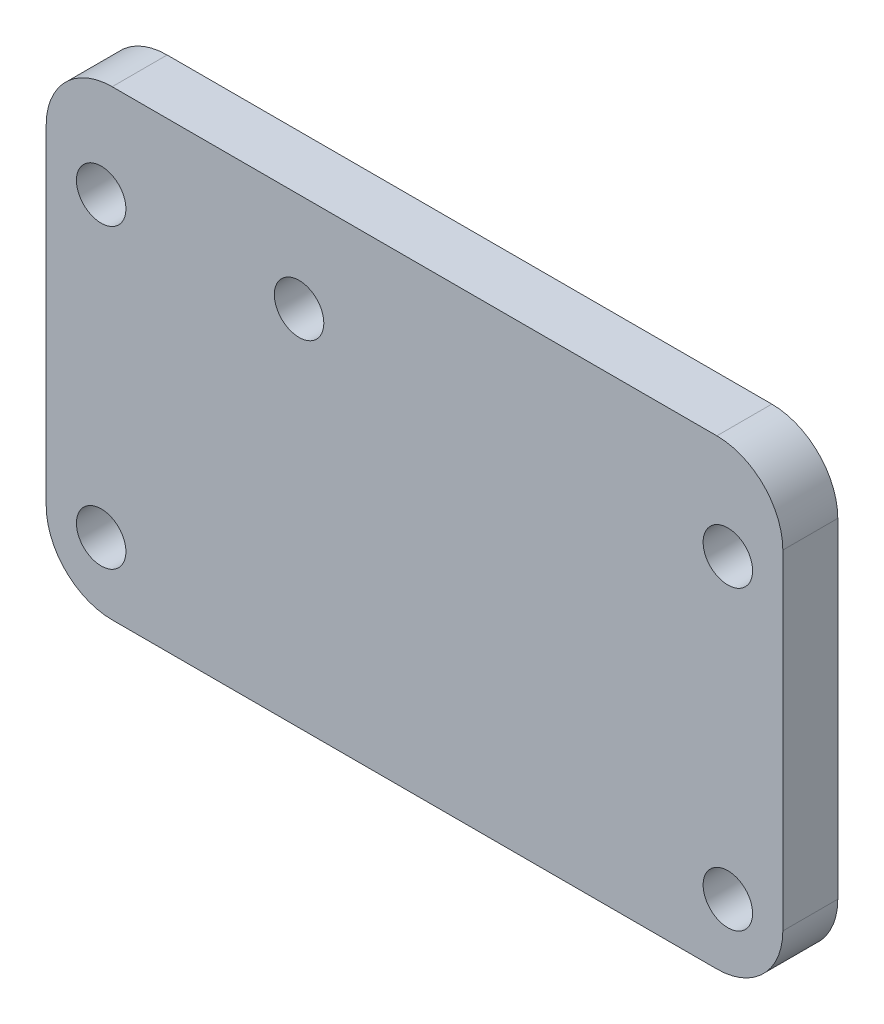
ISO-10303-21;
HEADER;
FILE_DESCRIPTION(('STEP AP214'),'2;1');
FILE_NAME('part.step','',(''),(''),'','','');
FILE_SCHEMA(('AUTOMOTIVE_DESIGN { 1 0 10303 214 1 1 1 1 }'));
ENDSEC;
DATA;
#1=APPLICATION_CONTEXT('core data for automotive mechanical design processes');
#2=APPLICATION_PROTOCOL_DEFINITION('international standard','automotive_design',2000,#1);
#3=PRODUCT_CONTEXT('',#1,'mechanical');
#4=PRODUCT('Part','Part','',(#3));
#5=PRODUCT_RELATED_PRODUCT_CATEGORY('part','',(#4));
#6=PRODUCT_DEFINITION_FORMATION('','',#4);
#7=PRODUCT_DEFINITION_CONTEXT('part definition',#1,'design');
#8=PRODUCT_DEFINITION('design','',#6,#7);
#9=PRODUCT_DEFINITION_SHAPE('','',#8);
#10=(LENGTH_UNIT() NAMED_UNIT(*) SI_UNIT(.MILLI.,.METRE.));
#11=(NAMED_UNIT(*) PLANE_ANGLE_UNIT() SI_UNIT($,.RADIAN.));
#12=(NAMED_UNIT(*) SI_UNIT($,.STERADIAN.) SOLID_ANGLE_UNIT());
#13=UNCERTAINTY_MEASURE_WITH_UNIT(LENGTH_MEASURE(1.E-05),#10,'distance_accuracy_value','');
#14=(GEOMETRIC_REPRESENTATION_CONTEXT(3) GLOBAL_UNCERTAINTY_ASSIGNED_CONTEXT((#13)) GLOBAL_UNIT_ASSIGNED_CONTEXT((#10,
#11,#12)) REPRESENTATION_CONTEXT('',''));
#15=CARTESIAN_POINT('',(0.,0.,0.));
#16=DIRECTION('',(0.,0.,1.));
#17=DIRECTION('',(1.,0.,0.));
#18=AXIS2_PLACEMENT_3D('',#15,#16,#17);
#19=CARTESIAN_POINT('',(0.,0.,5.));
#20=DIRECTION('',(1.,0.,0.));
#21=DIRECTION('',(0.,0.,-1.));
#22=AXIS2_PLACEMENT_3D('',#19,#20,#21);
#23=PLANE('',#22);
#24=DIRECTION('',(0.,-1.,0.));
#25=VECTOR('',#24,1.);
#26=CARTESIAN_POINT('',(0.,0.,0.));
#27=LINE('',#26,#25);
#28=CARTESIAN_POINT('',(0.,36.,0.));
#29=VERTEX_POINT('',#28);
#30=CARTESIAN_POINT('',(0.,6.,0.));
#31=VERTEX_POINT('',#30);
#32=EDGE_CURVE('E242',#29,#31,#27,.T.);
#33=ORIENTED_EDGE('',*,*,#32,.T.);
#34=DIRECTION('',(0.,0.,-1.));
#35=VECTOR('',#34,1.);
#36=CARTESIAN_POINT('',(0.,6.,5.));
#37=LINE('',#36,#35);
#38=CARTESIAN_POINT('',(0.,6.,5.));
#39=VERTEX_POINT('',#38);
#40=EDGE_CURVE('E284',#31,#39,#37,.F.);
#41=ORIENTED_EDGE('',*,*,#40,.T.);
#42=DIRECTION('',(0.,-1.,0.));
#43=VECTOR('',#42,1.);
#44=CARTESIAN_POINT('',(0.,0.,5.));
#45=LINE('',#44,#43);
#46=CARTESIAN_POINT('',(0.,36.,5.));
#47=VERTEX_POINT('',#46);
#48=EDGE_CURVE('E245',#47,#39,#45,.T.);
#49=ORIENTED_EDGE('',*,*,#48,.F.);
#50=DIRECTION('',(0.,0.,-1.));
#51=VECTOR('',#50,1.);
#52=CARTESIAN_POINT('',(0.,36.,5.));
#53=LINE('',#52,#51);
#54=EDGE_CURVE('E281',#47,#29,#53,.T.);
#55=ORIENTED_EDGE('',*,*,#54,.T.);
#56=EDGE_LOOP('',(#33,#41,#49,#55));
#57=FACE_BOUND('',#56,.T.);
#58=ADVANCED_FACE('F35',(#57),#23,.F.);
#59=CARTESIAN_POINT('',(0.,0.,5.));
#60=DIRECTION('',(0.,1.,0.));
#61=DIRECTION('',(0.,0.,1.));
#62=AXIS2_PLACEMENT_3D('',#59,#60,#61);
#63=PLANE('',#62);
#64=DIRECTION('',(1.,0.,0.));
#65=VECTOR('',#64,1.);
#66=CARTESIAN_POINT('',(0.,0.,5.));
#67=LINE('',#66,#65);
#68=CARTESIAN_POINT('',(6.,0.,5.));
#69=VERTEX_POINT('',#68);
#70=CARTESIAN_POINT('',(61.,0.,5.));
#71=VERTEX_POINT('',#70);
#72=EDGE_CURVE('E248',#69,#71,#67,.T.);
#73=ORIENTED_EDGE('',*,*,#72,.F.);
#74=DIRECTION('',(0.,0.,-1.));
#75=VECTOR('',#74,1.);
#76=CARTESIAN_POINT('',(6.,0.,5.));
#77=LINE('',#76,#75);
#78=CARTESIAN_POINT('',(6.,0.,0.));
#79=VERTEX_POINT('',#78);
#80=EDGE_CURVE('E270',#69,#79,#77,.T.);
#81=ORIENTED_EDGE('',*,*,#80,.T.);
#82=DIRECTION('',(1.,0.,0.));
#83=VECTOR('',#82,1.);
#84=CARTESIAN_POINT('',(0.,0.,0.));
#85=LINE('',#84,#83);
#86=CARTESIAN_POINT('',(61.,0.,0.));
#87=VERTEX_POINT('',#86);
#88=EDGE_CURVE('E261',#79,#87,#85,.T.);
#89=ORIENTED_EDGE('',*,*,#88,.T.);
#90=DIRECTION('',(0.,0.,-1.));
#91=VECTOR('',#90,1.);
#92=CARTESIAN_POINT('',(61.,0.,5.));
#93=LINE('',#92,#91);
#94=EDGE_CURVE('E258',#87,#71,#93,.F.);
#95=ORIENTED_EDGE('',*,*,#94,.T.);
#96=EDGE_LOOP('',(#73,#81,#89,#95));
#97=FACE_BOUND('',#96,.T.);
#98=ADVANCED_FACE('F333',(#97),#63,.F.);
#99=CARTESIAN_POINT('',(67.,0.,5.));
#100=DIRECTION('',(-1.,0.,0.));
#101=DIRECTION('',(0.,0.,1.));
#102=AXIS2_PLACEMENT_3D('',#99,#100,#101);
#103=PLANE('',#102);
#104=DIRECTION('',(0.,1.,0.));
#105=VECTOR('',#104,1.);
#106=CARTESIAN_POINT('',(67.,0.,5.));
#107=LINE('',#106,#105);
#108=CARTESIAN_POINT('',(67.,6.,5.));
#109=VERTEX_POINT('',#108);
#110=CARTESIAN_POINT('',(67.,36.,5.));
#111=VERTEX_POINT('',#110);
#112=EDGE_CURVE('E252',#109,#111,#107,.T.);
#113=ORIENTED_EDGE('',*,*,#112,.F.);
#114=DIRECTION('',(0.,0.,-1.));
#115=VECTOR('',#114,1.);
#116=CARTESIAN_POINT('',(67.,6.,5.));
#117=LINE('',#116,#115);
#118=CARTESIAN_POINT('',(67.,6.,0.));
#119=VERTEX_POINT('',#118);
#120=EDGE_CURVE('E11',#109,#119,#117,.T.);
#121=ORIENTED_EDGE('',*,*,#120,.T.);
#122=DIRECTION('',(0.,1.,0.));
#123=VECTOR('',#122,1.);
#124=CARTESIAN_POINT('',(67.,0.,0.));
#125=LINE('',#124,#123);
#126=CARTESIAN_POINT('',(67.,36.,0.));
#127=VERTEX_POINT('',#126);
#128=EDGE_CURVE('E264',#119,#127,#125,.T.);
#129=ORIENTED_EDGE('',*,*,#128,.T.);
#130=DIRECTION('',(0.,0.,-1.));
#131=VECTOR('',#130,1.);
#132=CARTESIAN_POINT('',(67.,36.,5.));
#133=LINE('',#132,#131);
#134=EDGE_CURVE('E44',#127,#111,#133,.F.);
#135=ORIENTED_EDGE('',*,*,#134,.T.);
#136=EDGE_LOOP('',(#113,#121,#129,#135));
#137=FACE_BOUND('',#136,.T.);
#138=ADVANCED_FACE('F302',(#137),#103,.F.);
#139=CARTESIAN_POINT('',(0.,42.,5.));
#140=DIRECTION('',(0.,-1.,0.));
#141=DIRECTION('',(0.,0.,-1.));
#142=AXIS2_PLACEMENT_3D('',#139,#140,#141);
#143=PLANE('',#142);
#144=DIRECTION('',(-1.,0.,0.));
#145=VECTOR('',#144,1.);
#146=CARTESIAN_POINT('',(0.,42.,0.));
#147=LINE('',#146,#145);
#148=CARTESIAN_POINT('',(61.,42.,0.));
#149=VERTEX_POINT('',#148);
#150=CARTESIAN_POINT('',(6.,42.,0.));
#151=VERTEX_POINT('',#150);
#152=EDGE_CURVE('E249',#149,#151,#147,.T.);
#153=ORIENTED_EDGE('',*,*,#152,.T.);
#154=DIRECTION('',(0.,0.,-1.));
#155=VECTOR('',#154,1.);
#156=CARTESIAN_POINT('',(6.,42.,5.));
#157=LINE('',#156,#155);
#158=CARTESIAN_POINT('',(6.,42.,5.));
#159=VERTEX_POINT('',#158);
#160=EDGE_CURVE('E297',#151,#159,#157,.F.);
#161=ORIENTED_EDGE('',*,*,#160,.T.);
#162=DIRECTION('',(-1.,0.,0.));
#163=VECTOR('',#162,1.);
#164=CARTESIAN_POINT('',(0.,42.,5.));
#165=LINE('',#164,#163);
#166=CARTESIAN_POINT('',(61.,42.,5.));
#167=VERTEX_POINT('',#166);
#168=EDGE_CURVE('E255',#167,#159,#165,.T.);
#169=ORIENTED_EDGE('',*,*,#168,.F.);
#170=DIRECTION('',(0.,0.,-1.));
#171=VECTOR('',#170,1.);
#172=CARTESIAN_POINT('',(61.,42.,5.));
#173=LINE('',#172,#171);
#174=EDGE_CURVE('E294',#167,#149,#173,.T.);
#175=ORIENTED_EDGE('',*,*,#174,.T.);
#176=EDGE_LOOP('',(#153,#161,#169,#175));
#177=FACE_BOUND('',#176,.T.);
#178=ADVANCED_FACE('F314',(#177),#143,.F.);
#179=CARTESIAN_POINT('',(0.,0.,5.));
#180=DIRECTION('',(0.,0.,-1.));
#181=DIRECTION('',(-1.,0.,0.));
#182=AXIS2_PLACEMENT_3D('',#179,#180,#181);
#183=PLANE('',#182);
#184=CARTESIAN_POINT('',(23.,33.,5.));
#185=DIRECTION('',(0.,0.,1.));
#186=DIRECTION('',(1.,0.,0.));
#187=AXIS2_PLACEMENT_3D('',#184,#185,#186);
#188=CIRCLE('',#187,2.25);
#189=CARTESIAN_POINT('',(25.25,33.,5.));
#190=VERTEX_POINT('',#189);
#191=EDGE_CURVE('E217',#190,#190,#188,.T.);
#192=ORIENTED_EDGE('',*,*,#191,.F.);
#193=EDGE_LOOP('',(#192));
#194=FACE_BOUND('',#193,.T.);
#195=CARTESIAN_POINT('',(62.,33.,5.));
#196=DIRECTION('',(0.,0.,-1.));
#197=DIRECTION('',(-1.,0.,0.));
#198=AXIS2_PLACEMENT_3D('',#195,#196,#197);
#199=CIRCLE('',#198,2.25);
#200=CARTESIAN_POINT('',(59.75,33.,5.));
#201=VERTEX_POINT('',#200);
#202=EDGE_CURVE('E220',#201,#201,#199,.T.);
#203=ORIENTED_EDGE('',*,*,#202,.T.);
#204=EDGE_LOOP('',(#203));
#205=FACE_BOUND('',#204,.T.);
#206=CARTESIAN_POINT('',(5.,6.,5.));
#207=DIRECTION('',(0.,0.,-1.));
#208=DIRECTION('',(-1.,0.,0.));
#209=AXIS2_PLACEMENT_3D('',#206,#207,#208);
#210=CIRCLE('',#209,2.25);
#211=CARTESIAN_POINT('',(2.75,6.,5.));
#212=VERTEX_POINT('',#211);
#213=EDGE_CURVE('E227',#212,#212,#210,.T.);
#214=ORIENTED_EDGE('',*,*,#213,.T.);
#215=EDGE_LOOP('',(#214));
#216=FACE_BOUND('',#215,.T.);
#217=CARTESIAN_POINT('',(5.,33.,5.));
#218=DIRECTION('',(0.,0.,-1.));
#219=DIRECTION('',(-1.,0.,0.));
#220=AXIS2_PLACEMENT_3D('',#217,#218,#219);
#221=CIRCLE('',#220,2.25);
#222=CARTESIAN_POINT('',(2.74999999999999,33.,5.));
#223=VERTEX_POINT('',#222);
#224=EDGE_CURVE('E233',#223,#223,#221,.T.);
#225=ORIENTED_EDGE('',*,*,#224,.T.);
#226=EDGE_LOOP('',(#225));
#227=FACE_BOUND('',#226,.T.);
#228=CARTESIAN_POINT('',(62.,6.,5.));
#229=DIRECTION('',(0.,0.,-1.));
#230=DIRECTION('',(-1.,0.,0.));
#231=AXIS2_PLACEMENT_3D('',#228,#229,#230);
#232=CIRCLE('',#231,2.25);
#233=CARTESIAN_POINT('',(59.75,6.,5.));
#234=VERTEX_POINT('',#233);
#235=EDGE_CURVE('E239',#234,#234,#232,.T.);
#236=ORIENTED_EDGE('',*,*,#235,.T.);
#237=EDGE_LOOP('',(#236));
#238=FACE_BOUND('',#237,.T.);
#239=ORIENTED_EDGE('',*,*,#48,.T.);
#240=CARTESIAN_POINT('',(6.,6.,5.));
#241=DIRECTION('',(0.,0.,-1.));
#242=DIRECTION('',(-1.,0.,0.));
#243=AXIS2_PLACEMENT_3D('',#240,#241,#242);
#244=CIRCLE('',#243,6.);
#245=EDGE_CURVE('E292',#39,#69,#244,.F.);
#246=ORIENTED_EDGE('',*,*,#245,.T.);
#247=ORIENTED_EDGE('',*,*,#72,.T.);
#248=CARTESIAN_POINT('',(61.,6.,5.));
#249=DIRECTION('',(0.,0.,-1.));
#250=DIRECTION('',(-1.,0.,0.));
#251=AXIS2_PLACEMENT_3D('',#248,#249,#250);
#252=CIRCLE('',#251,6.);
#253=EDGE_CURVE('E288',#71,#109,#252,.F.);
#254=ORIENTED_EDGE('',*,*,#253,.T.);
#255=ORIENTED_EDGE('',*,*,#112,.T.);
#256=CARTESIAN_POINT('',(61.,36.,5.));
#257=DIRECTION('',(0.,0.,-1.));
#258=DIRECTION('',(-1.,0.,0.));
#259=AXIS2_PLACEMENT_3D('',#256,#257,#258);
#260=CIRCLE('',#259,6.);
#261=EDGE_CURVE('E286',#111,#167,#260,.F.);
#262=ORIENTED_EDGE('',*,*,#261,.T.);
#263=ORIENTED_EDGE('',*,*,#168,.T.);
#264=CARTESIAN_POINT('',(6.,36.,5.));
#265=DIRECTION('',(0.,0.,-1.));
#266=DIRECTION('',(-1.,0.,0.));
#267=AXIS2_PLACEMENT_3D('',#264,#265,#266);
#268=CIRCLE('',#267,6.);
#269=EDGE_CURVE('E290',#159,#47,#268,.F.);
#270=ORIENTED_EDGE('',*,*,#269,.T.);
#271=EDGE_LOOP('',(#239,#246,#247,#254,#255,#262,#263,#270));
#272=FACE_BOUND('',#271,.T.);
#273=ADVANCED_FACE('F308',(#194,#205,#216,#227,#238,#272),#183,.F.);
#274=CARTESIAN_POINT('',(0.,0.,0.));
#275=DIRECTION('',(0.,0.,-1.));
#276=DIRECTION('',(-1.,0.,0.));
#277=AXIS2_PLACEMENT_3D('',#274,#275,#276);
#278=PLANE('',#277);
#279=DIRECTION('',(0.,-1.,0.));
#280=VECTOR('',#279,1.);
#281=CARTESIAN_POINT('',(30.,0.,0.));
#282=LINE('',#281,#280);
#283=CARTESIAN_POINT('',(30.,36.,0.));
#284=VERTEX_POINT('',#283);
#285=CARTESIAN_POINT('',(30.,30.,0.));
#286=VERTEX_POINT('',#285);
#287=EDGE_CURVE('E156',#284,#286,#282,.T.);
#288=ORIENTED_EDGE('',*,*,#287,.T.);
#289=DIRECTION('',(-1.,0.,0.));
#290=VECTOR('',#289,1.);
#291=CARTESIAN_POINT('',(0.,30.,0.));
#292=LINE('',#291,#290);
#293=CARTESIAN_POINT('',(55.,30.,0.));
#294=VERTEX_POINT('',#293);
#295=EDGE_CURVE('E170',#294,#286,#292,.T.);
#296=ORIENTED_EDGE('',*,*,#295,.F.);
#297=DIRECTION('',(0.,-1.,0.));
#298=VECTOR('',#297,1.);
#299=CARTESIAN_POINT('',(55.,0.,0.));
#300=LINE('',#299,#298);
#301=CARTESIAN_POINT('',(55.,36.,0.));
#302=VERTEX_POINT('',#301);
#303=EDGE_CURVE('E183',#302,#294,#300,.T.);
#304=ORIENTED_EDGE('',*,*,#303,.F.);
#305=DIRECTION('',(-1.,0.,0.));
#306=VECTOR('',#305,1.);
#307=CARTESIAN_POINT('',(0.,36.,0.));
#308=LINE('',#307,#306);
#309=EDGE_CURVE('E181',#302,#284,#308,.T.);
#310=ORIENTED_EDGE('',*,*,#309,.T.);
#311=EDGE_LOOP('',(#288,#296,#304,#310));
#312=FACE_BOUND('',#311,.T.);
#313=DIRECTION('',(-1.,0.,0.));
#314=VECTOR('',#313,1.);
#315=CARTESIAN_POINT('',(0.,36.,0.));
#316=LINE('',#315,#314);
#317=CARTESIAN_POINT('',(16.,36.,0.));
#318=VERTEX_POINT('',#317);
#319=CARTESIAN_POINT('',(12.,36.,0.));
#320=VERTEX_POINT('',#319);
#321=EDGE_CURVE('E161',#318,#320,#316,.T.);
#322=ORIENTED_EDGE('',*,*,#321,.T.);
#323=DIRECTION('',(0.,-1.,0.));
#324=VECTOR('',#323,1.);
#325=CARTESIAN_POINT('',(12.,0.,0.));
#326=LINE('',#325,#324);
#327=CARTESIAN_POINT('',(12.,30.,0.));
#328=VERTEX_POINT('',#327);
#329=EDGE_CURVE('E193',#320,#328,#326,.T.);
#330=ORIENTED_EDGE('',*,*,#329,.T.);
#331=DIRECTION('',(-1.,0.,0.));
#332=VECTOR('',#331,1.);
#333=CARTESIAN_POINT('',(0.,30.,0.));
#334=LINE('',#333,#332);
#335=CARTESIAN_POINT('',(16.,30.,0.));
#336=VERTEX_POINT('',#335);
#337=EDGE_CURVE('E203',#336,#328,#334,.T.);
#338=ORIENTED_EDGE('',*,*,#337,.F.);
#339=DIRECTION('',(0.,-1.,0.));
#340=VECTOR('',#339,1.);
#341=CARTESIAN_POINT('',(16.,0.,0.));
#342=LINE('',#341,#340);
#343=EDGE_CURVE('E59',#318,#336,#342,.T.);
#344=ORIENTED_EDGE('',*,*,#343,.F.);
#345=EDGE_LOOP('',(#322,#330,#338,#344));
#346=FACE_BOUND('',#345,.T.);
#347=CARTESIAN_POINT('',(23.,33.,0.));
#348=DIRECTION('',(0.,0.,-1.));
#349=DIRECTION('',(-1.,0.,0.));
#350=AXIS2_PLACEMENT_3D('',#347,#348,#349);
#351=CIRCLE('',#350,2.25);
#352=CARTESIAN_POINT('',(20.75,33.,0.));
#353=VERTEX_POINT('',#352);
#354=EDGE_CURVE('E39',#353,#353,#351,.T.);
#355=ORIENTED_EDGE('',*,*,#354,.F.);
#356=EDGE_LOOP('',(#355));
#357=FACE_BOUND('',#356,.T.);
#358=CARTESIAN_POINT('',(62.,33.,0.));
#359=DIRECTION('',(0.,0.,-1.));
#360=DIRECTION('',(-1.,0.,0.));
#361=AXIS2_PLACEMENT_3D('',#358,#359,#360);
#362=CIRCLE('',#361,2.25);
#363=CARTESIAN_POINT('',(59.75,33.,0.));
#364=VERTEX_POINT('',#363);
#365=EDGE_CURVE('E224',#364,#364,#362,.T.);
#366=ORIENTED_EDGE('',*,*,#365,.F.);
#367=EDGE_LOOP('',(#366));
#368=FACE_BOUND('',#367,.T.);
#369=CARTESIAN_POINT('',(5.,6.,0.));
#370=DIRECTION('',(0.,0.,-1.));
#371=DIRECTION('',(-1.,0.,0.));
#372=AXIS2_PLACEMENT_3D('',#369,#370,#371);
#373=CIRCLE('',#372,2.25);
#374=CARTESIAN_POINT('',(2.75,6.,0.));
#375=VERTEX_POINT('',#374);
#376=EDGE_CURVE('E230',#375,#375,#373,.T.);
#377=ORIENTED_EDGE('',*,*,#376,.F.);
#378=EDGE_LOOP('',(#377));
#379=FACE_BOUND('',#378,.T.);
#380=CARTESIAN_POINT('',(5.,33.,0.));
#381=DIRECTION('',(0.,0.,-1.));
#382=DIRECTION('',(-1.,0.,0.));
#383=AXIS2_PLACEMENT_3D('',#380,#381,#382);
#384=CIRCLE('',#383,2.25);
#385=CARTESIAN_POINT('',(2.74999999999999,33.,0.));
#386=VERTEX_POINT('',#385);
#387=EDGE_CURVE('E236',#386,#386,#384,.T.);
#388=ORIENTED_EDGE('',*,*,#387,.F.);
#389=EDGE_LOOP('',(#388));
#390=FACE_BOUND('',#389,.T.);
#391=CARTESIAN_POINT('',(62.,6.,0.));
#392=DIRECTION('',(0.,0.,-1.));
#393=DIRECTION('',(-1.,0.,0.));
#394=AXIS2_PLACEMENT_3D('',#391,#392,#393);
#395=CIRCLE('',#394,2.25);
#396=CARTESIAN_POINT('',(59.75,6.,0.));
#397=VERTEX_POINT('',#396);
#398=EDGE_CURVE('E223',#397,#397,#395,.T.);
#399=ORIENTED_EDGE('',*,*,#398,.F.);
#400=EDGE_LOOP('',(#399));
#401=FACE_BOUND('',#400,.T.);
#402=ORIENTED_EDGE('',*,*,#88,.F.);
#403=CARTESIAN_POINT('',(6.,6.,0.));
#404=DIRECTION('',(0.,0.,-1.));
#405=DIRECTION('',(-1.,0.,0.));
#406=AXIS2_PLACEMENT_3D('',#403,#404,#405);
#407=CIRCLE('',#406,6.);
#408=EDGE_CURVE('E279',#79,#31,#407,.T.);
#409=ORIENTED_EDGE('',*,*,#408,.T.);
#410=ORIENTED_EDGE('',*,*,#32,.F.);
#411=CARTESIAN_POINT('',(6.,36.,0.));
#412=DIRECTION('',(0.,0.,-1.));
#413=DIRECTION('',(-1.,0.,0.));
#414=AXIS2_PLACEMENT_3D('',#411,#412,#413);
#415=CIRCLE('',#414,6.);
#416=EDGE_CURVE('E277',#29,#151,#415,.T.);
#417=ORIENTED_EDGE('',*,*,#416,.T.);
#418=ORIENTED_EDGE('',*,*,#152,.F.);
#419=CARTESIAN_POINT('',(61.,36.,0.));
#420=DIRECTION('',(0.,0.,-1.));
#421=DIRECTION('',(-1.,0.,0.));
#422=AXIS2_PLACEMENT_3D('',#419,#420,#421);
#423=CIRCLE('',#422,6.);
#424=EDGE_CURVE('E273',#149,#127,#423,.T.);
#425=ORIENTED_EDGE('',*,*,#424,.T.);
#426=ORIENTED_EDGE('',*,*,#128,.F.);
#427=CARTESIAN_POINT('',(61.,6.,0.));
#428=DIRECTION('',(0.,0.,-1.));
#429=DIRECTION('',(-1.,0.,0.));
#430=AXIS2_PLACEMENT_3D('',#427,#428,#429);
#431=CIRCLE('',#430,6.);
#432=EDGE_CURVE('E275',#119,#87,#431,.T.);
#433=ORIENTED_EDGE('',*,*,#432,.T.);
#434=EDGE_LOOP('',(#402,#409,#410,#417,#418,#425,#426,#433));
#435=FACE_BOUND('',#434,.T.);
#436=ADVANCED_FACE('F318',(#312,#346,#357,#368,#379,#390,#401,#435),#278,.T.);
#437=CARTESIAN_POINT('',(62.,6.,5.));
#438=DIRECTION('',(0.,0.,-1.));
#439=DIRECTION('',(-1.,0.,0.));
#440=AXIS2_PLACEMENT_3D('',#437,#438,#439);
#441=CYLINDRICAL_SURFACE('',#440,2.25);
#442=ORIENTED_EDGE('',*,*,#235,.F.);
#443=EDGE_LOOP('',(#442));
#444=FACE_BOUND('',#443,.T.);
#445=ORIENTED_EDGE('',*,*,#398,.T.);
#446=EDGE_LOOP('',(#445));
#447=FACE_BOUND('',#446,.T.);
#448=ADVANCED_FACE('F373',(#444,#447),#441,.F.);
#449=CARTESIAN_POINT('',(5.,33.,5.));
#450=DIRECTION('',(0.,0.,-1.));
#451=DIRECTION('',(-1.,0.,0.));
#452=AXIS2_PLACEMENT_3D('',#449,#450,#451);
#453=CYLINDRICAL_SURFACE('',#452,2.25);
#454=ORIENTED_EDGE('',*,*,#224,.F.);
#455=EDGE_LOOP('',(#454));
#456=FACE_BOUND('',#455,.T.);
#457=ORIENTED_EDGE('',*,*,#387,.T.);
#458=EDGE_LOOP('',(#457));
#459=FACE_BOUND('',#458,.T.);
#460=ADVANCED_FACE('F363',(#456,#459),#453,.F.);
#461=CARTESIAN_POINT('',(5.,6.,5.));
#462=DIRECTION('',(0.,0.,-1.));
#463=DIRECTION('',(-1.,0.,0.));
#464=AXIS2_PLACEMENT_3D('',#461,#462,#463);
#465=CYLINDRICAL_SURFACE('',#464,2.25);
#466=ORIENTED_EDGE('',*,*,#213,.F.);
#467=EDGE_LOOP('',(#466));
#468=FACE_BOUND('',#467,.T.);
#469=ORIENTED_EDGE('',*,*,#376,.T.);
#470=EDGE_LOOP('',(#469));
#471=FACE_BOUND('',#470,.T.);
#472=ADVANCED_FACE('F357',(#468,#471),#465,.F.);
#473=CARTESIAN_POINT('',(62.,33.,5.));
#474=DIRECTION('',(0.,0.,-1.));
#475=DIRECTION('',(-1.,0.,0.));
#476=AXIS2_PLACEMENT_3D('',#473,#474,#475);
#477=CYLINDRICAL_SURFACE('',#476,2.25);
#478=ORIENTED_EDGE('',*,*,#202,.F.);
#479=EDGE_LOOP('',(#478));
#480=FACE_BOUND('',#479,.T.);
#481=ORIENTED_EDGE('',*,*,#365,.T.);
#482=EDGE_LOOP('',(#481));
#483=FACE_BOUND('',#482,.T.);
#484=ADVANCED_FACE('F353',(#480,#483),#477,.F.);
#485=CARTESIAN_POINT('',(6.,6.,5.));
#486=DIRECTION('',(0.,0.,-1.));
#487=DIRECTION('',(-1.,0.,0.));
#488=AXIS2_PLACEMENT_3D('',#485,#486,#487);
#489=CYLINDRICAL_SURFACE('',#488,6.);
#490=ORIENTED_EDGE('',*,*,#245,.F.);
#491=ORIENTED_EDGE('',*,*,#40,.F.);
#492=ORIENTED_EDGE('',*,*,#408,.F.);
#493=ORIENTED_EDGE('',*,*,#80,.F.);
#494=EDGE_LOOP('',(#490,#491,#492,#493));
#495=FACE_BOUND('',#494,.T.);
#496=ADVANCED_FACE('F331',(#495),#489,.T.);
#497=CARTESIAN_POINT('',(6.,36.,5.));
#498=DIRECTION('',(0.,0.,-1.));
#499=DIRECTION('',(-1.,0.,0.));
#500=AXIS2_PLACEMENT_3D('',#497,#498,#499);
#501=CYLINDRICAL_SURFACE('',#500,6.);
#502=ORIENTED_EDGE('',*,*,#269,.F.);
#503=ORIENTED_EDGE('',*,*,#160,.F.);
#504=ORIENTED_EDGE('',*,*,#416,.F.);
#505=ORIENTED_EDGE('',*,*,#54,.F.);
#506=EDGE_LOOP('',(#502,#503,#504,#505));
#507=FACE_BOUND('',#506,.T.);
#508=ADVANCED_FACE('F323',(#507),#501,.T.);
#509=CARTESIAN_POINT('',(61.,6.,5.));
#510=DIRECTION('',(0.,0.,-1.));
#511=DIRECTION('',(-1.,0.,0.));
#512=AXIS2_PLACEMENT_3D('',#509,#510,#511);
#513=CYLINDRICAL_SURFACE('',#512,6.);
#514=ORIENTED_EDGE('',*,*,#253,.F.);
#515=ORIENTED_EDGE('',*,*,#94,.F.);
#516=ORIENTED_EDGE('',*,*,#432,.F.);
#517=ORIENTED_EDGE('',*,*,#120,.F.);
#518=EDGE_LOOP('',(#514,#515,#516,#517));
#519=FACE_BOUND('',#518,.T.);
#520=ADVANCED_FACE('F336',(#519),#513,.T.);
#521=CARTESIAN_POINT('',(61.,36.,5.));
#522=DIRECTION('',(0.,0.,-1.));
#523=DIRECTION('',(-1.,0.,0.));
#524=AXIS2_PLACEMENT_3D('',#521,#522,#523);
#525=CYLINDRICAL_SURFACE('',#524,6.);
#526=ORIENTED_EDGE('',*,*,#261,.F.);
#527=ORIENTED_EDGE('',*,*,#134,.F.);
#528=ORIENTED_EDGE('',*,*,#424,.F.);
#529=ORIENTED_EDGE('',*,*,#174,.F.);
#530=EDGE_LOOP('',(#526,#527,#528,#529));
#531=FACE_BOUND('',#530,.T.);
#532=ADVANCED_FACE('F37',(#531),#525,.T.);
#533=CARTESIAN_POINT('',(23.,33.,-5.));
#534=DIRECTION('',(0.,0.,1.));
#535=DIRECTION('',(1.,0.,0.));
#536=AXIS2_PLACEMENT_3D('',#533,#534,#535);
#537=CYLINDRICAL_SURFACE('',#536,2.25);
#538=ORIENTED_EDGE('',*,*,#354,.T.);
#539=EDGE_LOOP('',(#538));
#540=FACE_BOUND('',#539,.T.);
#541=ORIENTED_EDGE('',*,*,#191,.T.);
#542=EDGE_LOOP('',(#541));
#543=FACE_BOUND('',#542,.T.);
#544=ADVANCED_FACE('F342',(#540,#543),#537,.F.);
#545=CARTESIAN_POINT('',(0.,36.,-4.));
#546=DIRECTION('',(0.,1.,0.));
#547=DIRECTION('',(0.,0.,1.));
#548=AXIS2_PLACEMENT_3D('',#545,#546,#547);
#549=PLANE('',#548);
#550=ORIENTED_EDGE('',*,*,#321,.F.);
#551=DIRECTION('',(0.,0.,1.));
#552=VECTOR('',#551,1.);
#553=CARTESIAN_POINT('',(16.,36.,-4.));
#554=LINE('',#553,#552);
#555=CARTESIAN_POINT('',(16.,36.,-4.));
#556=VERTEX_POINT('',#555);
#557=EDGE_CURVE('E215',#556,#318,#554,.T.);
#558=ORIENTED_EDGE('',*,*,#557,.F.);
#559=DIRECTION('',(-1.,0.,0.));
#560=VECTOR('',#559,1.);
#561=CARTESIAN_POINT('',(0.,36.,-4.));
#562=LINE('',#561,#560);
#563=CARTESIAN_POINT('',(12.,36.,-4.));
#564=VERTEX_POINT('',#563);
#565=EDGE_CURVE('E189',#556,#564,#562,.T.);
#566=ORIENTED_EDGE('',*,*,#565,.T.);
#567=DIRECTION('',(0.,0.,1.));
#568=VECTOR('',#567,1.);
#569=CARTESIAN_POINT('',(12.,36.,-4.));
#570=LINE('',#569,#568);
#571=EDGE_CURVE('E200',#564,#320,#570,.T.);
#572=ORIENTED_EDGE('',*,*,#571,.T.);
#573=EDGE_LOOP('',(#550,#558,#566,#572));
#574=FACE_BOUND('',#573,.T.);
#575=ADVANCED_FACE('F467',(#574),#549,.T.);
#576=CARTESIAN_POINT('',(16.,0.,-4.));
#577=DIRECTION('',(-1.,0.,0.));
#578=DIRECTION('',(0.,-1.,0.));
#579=AXIS2_PLACEMENT_3D('',#576,#577,#578);
#580=PLANE('',#579);
#581=ORIENTED_EDGE('',*,*,#343,.T.);
#582=DIRECTION('',(0.,0.,1.));
#583=VECTOR('',#582,1.);
#584=CARTESIAN_POINT('',(16.,30.,-4.));
#585=LINE('',#584,#583);
#586=CARTESIAN_POINT('',(16.,30.,-4.));
#587=VERTEX_POINT('',#586);
#588=EDGE_CURVE('E212',#587,#336,#585,.T.);
#589=ORIENTED_EDGE('',*,*,#588,.F.);
#590=DIRECTION('',(0.,-1.,0.));
#591=VECTOR('',#590,1.);
#592=CARTESIAN_POINT('',(16.,0.,-4.));
#593=LINE('',#592,#591);
#594=EDGE_CURVE('E192',#556,#587,#593,.T.);
#595=ORIENTED_EDGE('',*,*,#594,.F.);
#596=ORIENTED_EDGE('',*,*,#557,.T.);
#597=EDGE_LOOP('',(#581,#589,#595,#596));
#598=FACE_BOUND('',#597,.T.);
#599=ADVANCED_FACE('F474',(#598),#580,.F.);
#600=CARTESIAN_POINT('',(0.,30.,-4.));
#601=DIRECTION('',(0.,1.,0.));
#602=DIRECTION('',(-1.,0.,0.));
#603=AXIS2_PLACEMENT_3D('',#600,#601,#602);
#604=PLANE('',#603);
#605=ORIENTED_EDGE('',*,*,#337,.T.);
#606=DIRECTION('',(0.,0.,1.));
#607=VECTOR('',#606,1.);
#608=CARTESIAN_POINT('',(12.,30.,-4.));
#609=LINE('',#608,#607);
#610=CARTESIAN_POINT('',(12.,30.,-4.));
#611=VERTEX_POINT('',#610);
#612=EDGE_CURVE('E209',#611,#328,#609,.T.);
#613=ORIENTED_EDGE('',*,*,#612,.F.);
#614=DIRECTION('',(-1.,0.,0.));
#615=VECTOR('',#614,1.);
#616=CARTESIAN_POINT('',(0.,30.,-4.));
#617=LINE('',#616,#615);
#618=EDGE_CURVE('E195',#587,#611,#617,.T.);
#619=ORIENTED_EDGE('',*,*,#618,.F.);
#620=ORIENTED_EDGE('',*,*,#588,.T.);
#621=EDGE_LOOP('',(#605,#613,#619,#620));
#622=FACE_BOUND('',#621,.T.);
#623=ADVANCED_FACE('F482',(#622),#604,.F.);
#624=CARTESIAN_POINT('',(12.,0.,-4.));
#625=DIRECTION('',(-1.,0.,0.));
#626=DIRECTION('',(0.,-1.,0.));
#627=AXIS2_PLACEMENT_3D('',#624,#625,#626);
#628=PLANE('',#627);
#629=ORIENTED_EDGE('',*,*,#329,.F.);
#630=ORIENTED_EDGE('',*,*,#571,.F.);
#631=DIRECTION('',(0.,-1.,0.));
#632=VECTOR('',#631,1.);
#633=CARTESIAN_POINT('',(12.,0.,-4.));
#634=LINE('',#633,#632);
#635=EDGE_CURVE('E197',#564,#611,#634,.T.);
#636=ORIENTED_EDGE('',*,*,#635,.T.);
#637=ORIENTED_EDGE('',*,*,#612,.T.);
#638=EDGE_LOOP('',(#629,#630,#636,#637));
#639=FACE_BOUND('',#638,.T.);
#640=ADVANCED_FACE('F491',(#639),#628,.T.);
#641=CARTESIAN_POINT('',(0.,0.,-4.));
#642=DIRECTION('',(0.,0.,-1.));
#643=DIRECTION('',(-1.,0.,0.));
#644=AXIS2_PLACEMENT_3D('',#641,#642,#643);
#645=PLANE('',#644);
#646=ORIENTED_EDGE('',*,*,#565,.F.);
#647=ORIENTED_EDGE('',*,*,#594,.T.);
#648=ORIENTED_EDGE('',*,*,#618,.T.);
#649=ORIENTED_EDGE('',*,*,#635,.F.);
#650=EDGE_LOOP('',(#646,#647,#648,#649));
#651=FACE_BOUND('',#650,.T.);
#652=ADVANCED_FACE('F500',(#651),#645,.T.);
#653=CARTESIAN_POINT('',(30.,0.,-4.));
#654=DIRECTION('',(-1.,0.,0.));
#655=DIRECTION('',(0.,-1.,0.));
#656=AXIS2_PLACEMENT_3D('',#653,#654,#655);
#657=PLANE('',#656);
#658=ORIENTED_EDGE('',*,*,#287,.F.);
#659=DIRECTION('',(0.,0.,1.));
#660=VECTOR('',#659,1.);
#661=CARTESIAN_POINT('',(30.,36.,-4.));
#662=LINE('',#661,#660);
#663=CARTESIAN_POINT('',(30.,36.,-4.));
#664=VERTEX_POINT('',#663);
#665=EDGE_CURVE('E151',#664,#284,#662,.T.);
#666=ORIENTED_EDGE('',*,*,#665,.F.);
#667=DIRECTION('',(0.,-1.,0.));
#668=VECTOR('',#667,1.);
#669=CARTESIAN_POINT('',(30.,0.,-4.));
#670=LINE('',#669,#668);
#671=CARTESIAN_POINT('',(30.,30.,-4.));
#672=VERTEX_POINT('',#671);
#673=EDGE_CURVE('E154',#664,#672,#670,.T.);
#674=ORIENTED_EDGE('',*,*,#673,.T.);
#675=DIRECTION('',(0.,0.,1.));
#676=VECTOR('',#675,1.);
#677=CARTESIAN_POINT('',(30.,30.,-4.));
#678=LINE('',#677,#676);
#679=EDGE_CURVE('E179',#672,#286,#678,.T.);
#680=ORIENTED_EDGE('',*,*,#679,.T.);
#681=EDGE_LOOP('',(#658,#666,#674,#680));
#682=FACE_BOUND('',#681,.T.);
#683=ADVANCED_FACE('F153',(#682),#657,.T.);
#684=CARTESIAN_POINT('',(0.,36.,-4.));
#685=DIRECTION('',(0.,1.,0.));
#686=DIRECTION('',(0.,0.,1.));
#687=AXIS2_PLACEMENT_3D('',#684,#685,#686);
#688=PLANE('',#687);
#689=ORIENTED_EDGE('',*,*,#309,.F.);
#690=DIRECTION('',(0.,0.,1.));
#691=VECTOR('',#690,1.);
#692=CARTESIAN_POINT('',(55.,36.,-4.));
#693=LINE('',#692,#691);
#694=CARTESIAN_POINT('',(55.,36.,-4.));
#695=VERTEX_POINT('',#694);
#696=EDGE_CURVE('E162',#695,#302,#693,.T.);
#697=ORIENTED_EDGE('',*,*,#696,.F.);
#698=DIRECTION('',(-1.,0.,0.));
#699=VECTOR('',#698,1.);
#700=CARTESIAN_POINT('',(0.,36.,-4.));
#701=LINE('',#700,#699);
#702=EDGE_CURVE('E167',#695,#664,#701,.T.);
#703=ORIENTED_EDGE('',*,*,#702,.T.);
#704=ORIENTED_EDGE('',*,*,#665,.T.);
#705=EDGE_LOOP('',(#689,#697,#703,#704));
#706=FACE_BOUND('',#705,.T.);
#707=ADVANCED_FACE('F172',(#706),#688,.T.);
#708=CARTESIAN_POINT('',(55.,0.,-4.));
#709=DIRECTION('',(-1.,0.,0.));
#710=DIRECTION('',(0.,0.,1.));
#711=AXIS2_PLACEMENT_3D('',#708,#709,#710);
#712=PLANE('',#711);
#713=ORIENTED_EDGE('',*,*,#303,.T.);
#714=DIRECTION('',(0.,0.,1.));
#715=VECTOR('',#714,1.);
#716=CARTESIAN_POINT('',(55.,30.,-4.));
#717=LINE('',#716,#715);
#718=CARTESIAN_POINT('',(55.,30.,-4.));
#719=VERTEX_POINT('',#718);
#720=EDGE_CURVE('E51',#719,#294,#717,.T.);
#721=ORIENTED_EDGE('',*,*,#720,.F.);
#722=DIRECTION('',(0.,-1.,0.));
#723=VECTOR('',#722,1.);
#724=CARTESIAN_POINT('',(55.,0.,-4.));
#725=LINE('',#724,#723);
#726=EDGE_CURVE('E174',#695,#719,#725,.T.);
#727=ORIENTED_EDGE('',*,*,#726,.F.);
#728=ORIENTED_EDGE('',*,*,#696,.T.);
#729=EDGE_LOOP('',(#713,#721,#727,#728));
#730=FACE_BOUND('',#729,.T.);
#731=ADVANCED_FACE('F524',(#730),#712,.F.);
#732=CARTESIAN_POINT('',(0.,30.,-4.));
#733=DIRECTION('',(0.,1.,0.));
#734=DIRECTION('',(-1.,0.,0.));
#735=AXIS2_PLACEMENT_3D('',#732,#733,#734);
#736=PLANE('',#735);
#737=ORIENTED_EDGE('',*,*,#295,.T.);
#738=ORIENTED_EDGE('',*,*,#679,.F.);
#739=DIRECTION('',(-1.,0.,0.));
#740=VECTOR('',#739,1.);
#741=CARTESIAN_POINT('',(0.,30.,-4.));
#742=LINE('',#741,#740);
#743=EDGE_CURVE('E168',#719,#672,#742,.T.);
#744=ORIENTED_EDGE('',*,*,#743,.F.);
#745=ORIENTED_EDGE('',*,*,#720,.T.);
#746=EDGE_LOOP('',(#737,#738,#744,#745));
#747=FACE_BOUND('',#746,.T.);
#748=ADVANCED_FACE('F532',(#747),#736,.F.);
#749=CARTESIAN_POINT('',(0.,0.,-4.));
#750=DIRECTION('',(0.,0.,-1.));
#751=DIRECTION('',(-1.,0.,0.));
#752=AXIS2_PLACEMENT_3D('',#749,#750,#751);
#753=PLANE('',#752);
#754=ORIENTED_EDGE('',*,*,#673,.F.);
#755=ORIENTED_EDGE('',*,*,#702,.F.);
#756=ORIENTED_EDGE('',*,*,#726,.T.);
#757=ORIENTED_EDGE('',*,*,#743,.T.);
#758=EDGE_LOOP('',(#754,#755,#756,#757));
#759=FACE_BOUND('',#758,.T.);
#760=ADVANCED_FACE('F166',(#759),#753,.T.);
#761=CLOSED_SHELL('',(#58,#98,#138,#178,#273,#436,#448,#460,#472,#484,#496,#508,#520,#532,#544,
#575,#599,#623,#640,#652,#683,#707,#731,#748,#760));
#762=MANIFOLD_SOLID_BREP('B2',#761);
#763=ADVANCED_BREP_SHAPE_REPRESENTATION('',(#18,#762),#14);
#764=SHAPE_DEFINITION_REPRESENTATION(#9,#763);
ENDSEC;
END-ISO-10303-21;
